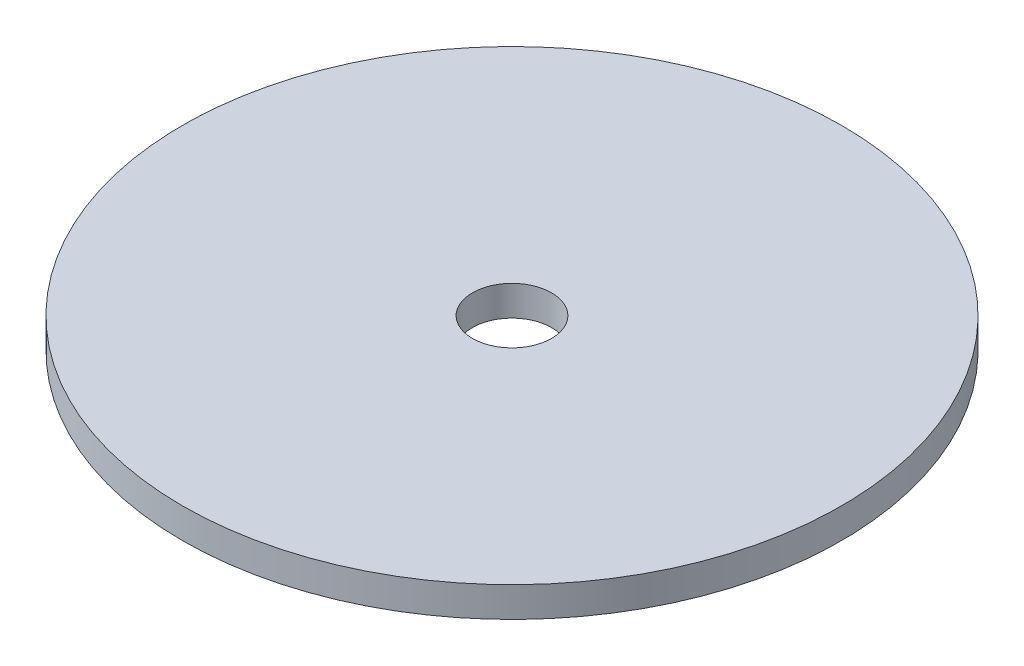
ISO-10303-21;
HEADER;
FILE_DESCRIPTION(('STEP AP214'),'2;1');
FILE_NAME('part.step','',(''),(''),'','','');
FILE_SCHEMA(('AUTOMOTIVE_DESIGN { 1 0 10303 214 1 1 1 1 }'));
ENDSEC;
DATA;
#1=APPLICATION_CONTEXT('core data for automotive mechanical design processes');
#2=APPLICATION_PROTOCOL_DEFINITION('international standard','automotive_design',2000,#1);
#3=PRODUCT_CONTEXT('',#1,'mechanical');
#4=PRODUCT('Part','Part','',(#3));
#5=PRODUCT_RELATED_PRODUCT_CATEGORY('part','',(#4));
#6=PRODUCT_DEFINITION_FORMATION('','',#4);
#7=PRODUCT_DEFINITION_CONTEXT('part definition',#1,'design');
#8=PRODUCT_DEFINITION('design','',#6,#7);
#9=PRODUCT_DEFINITION_SHAPE('','',#8);
#10=(LENGTH_UNIT() NAMED_UNIT(*) SI_UNIT(.MILLI.,.METRE.));
#11=(NAMED_UNIT(*) PLANE_ANGLE_UNIT() SI_UNIT($,.RADIAN.));
#12=(NAMED_UNIT(*) SI_UNIT($,.STERADIAN.) SOLID_ANGLE_UNIT());
#13=UNCERTAINTY_MEASURE_WITH_UNIT(LENGTH_MEASURE(1.E-05),#10,'distance_accuracy_value','');
#14=(GEOMETRIC_REPRESENTATION_CONTEXT(3) GLOBAL_UNCERTAINTY_ASSIGNED_CONTEXT((#13)) GLOBAL_UNIT_ASSIGNED_CONTEXT((#10,
#11,#12)) REPRESENTATION_CONTEXT('',''));
#15=CARTESIAN_POINT('',(0.,0.,0.));
#16=DIRECTION('',(0.,0.,1.));
#17=DIRECTION('',(1.,0.,0.));
#18=AXIS2_PLACEMENT_3D('',#15,#16,#17);
#19=CARTESIAN_POINT('',(0.,1.6,0.));
#20=DIRECTION('',(0.,1.,0.));
#21=DIRECTION('',(0.,0.,1.));
#22=AXIS2_PLACEMENT_3D('',#19,#20,#21);
#23=PLANE('',#22);
#24=CARTESIAN_POINT('',(0.,1.6,0.));
#25=DIRECTION('',(0.,1.,0.));
#26=DIRECTION('',(0.,0.,1.));
#27=AXIS2_PLACEMENT_3D('',#24,#25,#26);
#28=CIRCLE('',#27,17.5);
#29=CARTESIAN_POINT('',(0.,1.6,17.5));
#30=VERTEX_POINT('',#29);
#31=EDGE_CURVE('E10',#30,#30,#28,.T.);
#32=ORIENTED_EDGE('',*,*,#31,.T.);
#33=EDGE_LOOP('',(#32));
#34=FACE_BOUND('',#33,.T.);
#35=CARTESIAN_POINT('',(0.,1.6,0.));
#36=DIRECTION('',(0.,1.,0.));
#37=DIRECTION('',(0.,0.,1.));
#38=AXIS2_PLACEMENT_3D('',#35,#36,#37);
#39=CIRCLE('',#38,2.1);
#40=CARTESIAN_POINT('',(0.,1.6,2.1));
#41=VERTEX_POINT('',#40);
#42=EDGE_CURVE('E44',#41,#41,#39,.T.);
#43=ORIENTED_EDGE('',*,*,#42,.F.);
#44=EDGE_LOOP('',(#43));
#45=FACE_BOUND('',#44,.T.);
#46=ADVANCED_FACE('F33',(#34,#45),#23,.T.);
#47=CARTESIAN_POINT('',(0.,0.,0.));
#48=DIRECTION('',(0.,1.,0.));
#49=DIRECTION('',(0.,0.,1.));
#50=AXIS2_PLACEMENT_3D('',#47,#48,#49);
#51=PLANE('',#50);
#52=CARTESIAN_POINT('',(0.,0.,0.));
#53=DIRECTION('',(0.,1.,0.));
#54=DIRECTION('',(0.,0.,1.));
#55=AXIS2_PLACEMENT_3D('',#52,#53,#54);
#56=CIRCLE('',#55,17.5);
#57=CARTESIAN_POINT('',(0.,0.,17.5));
#58=VERTEX_POINT('',#57);
#59=EDGE_CURVE('E37',#58,#58,#56,.T.);
#60=ORIENTED_EDGE('',*,*,#59,.F.);
#61=EDGE_LOOP('',(#60));
#62=FACE_BOUND('',#61,.T.);
#63=CARTESIAN_POINT('',(0.,0.,0.));
#64=DIRECTION('',(0.,1.,0.));
#65=DIRECTION('',(0.,0.,1.));
#66=AXIS2_PLACEMENT_3D('',#63,#64,#65);
#67=CIRCLE('',#66,2.1);
#68=CARTESIAN_POINT('',(0.,0.,2.1));
#69=VERTEX_POINT('',#68);
#70=EDGE_CURVE('E46',#69,#69,#67,.T.);
#71=ORIENTED_EDGE('',*,*,#70,.T.);
#72=EDGE_LOOP('',(#71));
#73=FACE_BOUND('',#72,.T.);
#74=ADVANCED_FACE('F56',(#62,#73),#51,.F.);
#75=CARTESIAN_POINT('',(0.,1.6,0.));
#76=DIRECTION('',(0.,-1.,0.));
#77=DIRECTION('',(0.,0.,-1.));
#78=AXIS2_PLACEMENT_3D('',#75,#76,#77);
#79=CYLINDRICAL_SURFACE('',#78,17.5);
#80=ORIENTED_EDGE('',*,*,#31,.F.);
#81=EDGE_LOOP('',(#80));
#82=FACE_BOUND('',#81,.T.);
#83=ORIENTED_EDGE('',*,*,#59,.T.);
#84=EDGE_LOOP('',(#83));
#85=FACE_BOUND('',#84,.T.);
#86=ADVANCED_FACE('F35',(#82,#85),#79,.T.);
#87=CARTESIAN_POINT('',(0.,1.6,0.));
#88=DIRECTION('',(0.,-1.,0.));
#89=DIRECTION('',(0.,0.,-1.));
#90=AXIS2_PLACEMENT_3D('',#87,#88,#89);
#91=CYLINDRICAL_SURFACE('',#90,2.1);
#92=ORIENTED_EDGE('',*,*,#42,.T.);
#93=EDGE_LOOP('',(#92));
#94=FACE_BOUND('',#93,.T.);
#95=ORIENTED_EDGE('',*,*,#70,.F.);
#96=EDGE_LOOP('',(#95));
#97=FACE_BOUND('',#96,.T.);
#98=ADVANCED_FACE('F52',(#94,#97),#91,.F.);
#99=CLOSED_SHELL('',(#46,#74,#86,#98));
#100=MANIFOLD_SOLID_BREP('B2',#99);
#101=ADVANCED_BREP_SHAPE_REPRESENTATION('',(#18,#100),#14);
#102=SHAPE_DEFINITION_REPRESENTATION(#9,#101);
ENDSEC;
END-ISO-10303-21;
